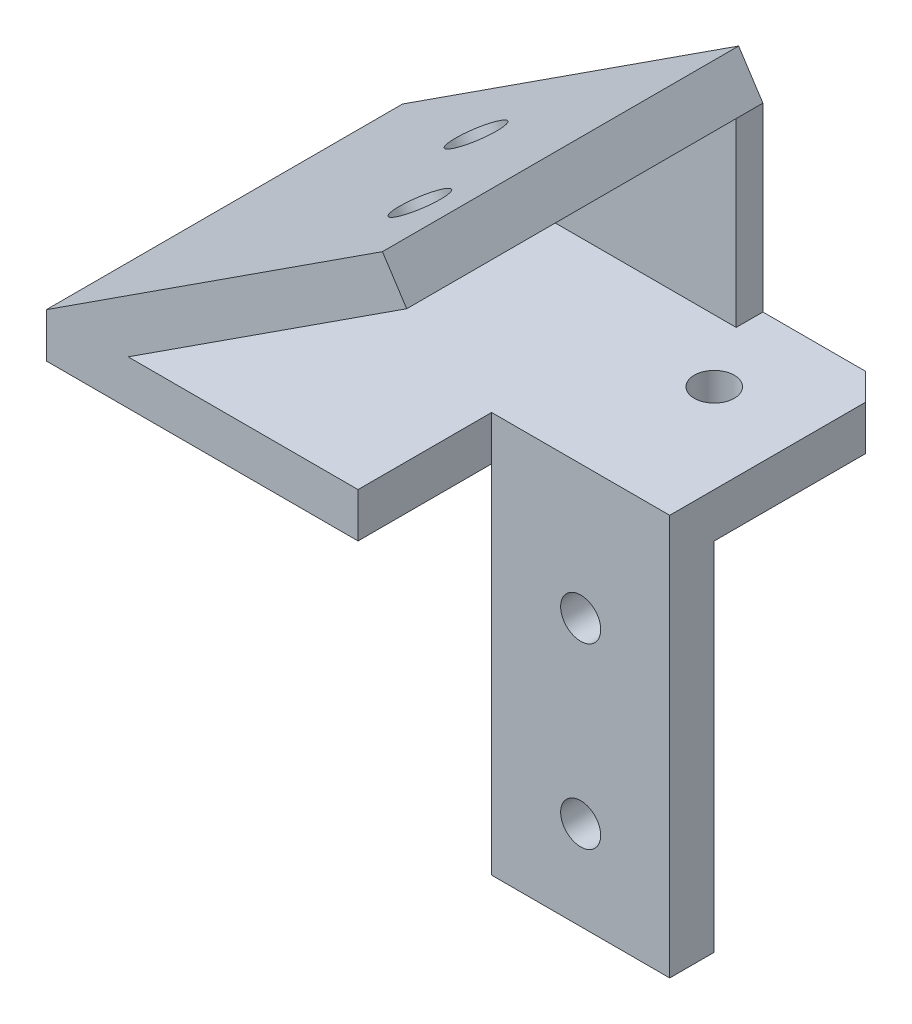
ISO-10303-21;
HEADER;
FILE_DESCRIPTION(('STEP AP214'),'2;1');
FILE_NAME('part.step','',(''),(''),'','','');
FILE_SCHEMA(('AUTOMOTIVE_DESIGN { 1 0 10303 214 1 1 1 1 }'));
ENDSEC;
DATA;
#1=APPLICATION_CONTEXT('core data for automotive mechanical design processes');
#2=APPLICATION_PROTOCOL_DEFINITION('international standard','automotive_design',2000,#1);
#3=PRODUCT_CONTEXT('',#1,'mechanical');
#4=PRODUCT('Part','Part','',(#3));
#5=PRODUCT_RELATED_PRODUCT_CATEGORY('part','',(#4));
#6=PRODUCT_DEFINITION_FORMATION('','',#4);
#7=PRODUCT_DEFINITION_CONTEXT('part definition',#1,'design');
#8=PRODUCT_DEFINITION('design','',#6,#7);
#9=PRODUCT_DEFINITION_SHAPE('','',#8);
#10=(LENGTH_UNIT() NAMED_UNIT(*) SI_UNIT(.MILLI.,.METRE.));
#11=(NAMED_UNIT(*) PLANE_ANGLE_UNIT() SI_UNIT($,.RADIAN.));
#12=(NAMED_UNIT(*) SI_UNIT($,.STERADIAN.) SOLID_ANGLE_UNIT());
#13=UNCERTAINTY_MEASURE_WITH_UNIT(LENGTH_MEASURE(1.E-05),#10,'distance_accuracy_value','');
#14=(GEOMETRIC_REPRESENTATION_CONTEXT(3) GLOBAL_UNCERTAINTY_ASSIGNED_CONTEXT((#13)) GLOBAL_UNIT_ASSIGNED_CONTEXT((#10,
#11,#12)) REPRESENTATION_CONTEXT('',''));
#15=CARTESIAN_POINT('',(0.,0.,0.));
#16=DIRECTION('',(0.,0.,1.));
#17=DIRECTION('',(1.,0.,0.));
#18=AXIS2_PLACEMENT_3D('',#15,#16,#17);
#19=CARTESIAN_POINT('',(5.46337073261944,25.3154037359487,-20.));
#20=DIRECTION('',(0.544639035015022,-0.838670567945427,0.));
#21=DIRECTION('',(0.838670567945427,0.544639035015022,0.));
#22=AXIS2_PLACEMENT_3D('',#19,#20,#21);
#23=PLANE('',#22);
#24=CARTESIAN_POINT('',(-2.08466437888939,20.4136524208135,8.25));
#25=DIRECTION('',(0.544639035015022,-0.838670567945427,0.));
#26=DIRECTION('',(0.838670567945427,0.544639035015022,0.));
#27=AXIS2_PLACEMENT_3D('',#24,#25,#26);
#28=CIRCLE('',#27,2.75);
#29=CARTESIAN_POINT('',(0.221679682960539,21.9114097671048,8.25));
#30=VERTEX_POINT('',#29);
#31=EDGE_CURVE('E162',#30,#30,#28,.F.);
#32=ORIENTED_EDGE('',*,*,#31,.T.);
#33=EDGE_LOOP('',(#32));
#34=FACE_BOUND('',#33,.T.);
#35=CARTESIAN_POINT('',(-12.0229106090427,13.9596798558855,-8.));
#36=DIRECTION('',(0.544639035015022,-0.838670567945427,0.));
#37=DIRECTION('',(0.838670567945427,0.544639035015022,0.));
#38=AXIS2_PLACEMENT_3D('',#35,#36,#37);
#39=CIRCLE('',#38,2.75);
#40=CARTESIAN_POINT('',(-9.71656654719277,15.4574372021768,-8.));
#41=VERTEX_POINT('',#40);
#42=EDGE_CURVE('E316',#41,#41,#39,.F.);
#43=ORIENTED_EDGE('',*,*,#42,.T.);
#44=EDGE_LOOP('',(#43));
#45=FACE_BOUND('',#44,.T.);
#46=DIRECTION('',(0.,0.,1.));
#47=VECTOR('',#46,1.);
#48=CARTESIAN_POINT('',(-25.8196077061162,5.,-20.));
#49=LINE('',#48,#47);
#50=CARTESIAN_POINT('',(-25.8196077061162,5.,-17.));
#51=VERTEX_POINT('',#50);
#52=CARTESIAN_POINT('',(-25.8196077061162,5.,20.));
#53=VERTEX_POINT('',#52);
#54=EDGE_CURVE('E171',#51,#53,#49,.T.);
#55=ORIENTED_EDGE('',*,*,#54,.F.);
#56=DIRECTION('',(0.838670567945427,0.544639035015022,0.));
#57=VECTOR('',#56,1.);
#58=CARTESIAN_POINT('',(-25.8196077061162,5.,-17.));
#59=LINE('',#58,#57);
#60=CARTESIAN_POINT('',(5.46337073261944,25.3154037359487,-17.));
#61=VERTEX_POINT('',#60);
#62=EDGE_CURVE('E156',#51,#61,#59,.T.);
#63=ORIENTED_EDGE('',*,*,#62,.T.);
#64=DIRECTION('',(0.,0.,1.));
#65=VECTOR('',#64,1.);
#66=CARTESIAN_POINT('',(5.46337073261944,25.3154037359487,-20.));
#67=LINE('',#66,#65);
#68=CARTESIAN_POINT('',(5.46337073261944,25.3154037359487,20.));
#69=VERTEX_POINT('',#68);
#70=EDGE_CURVE('E150',#61,#69,#67,.T.);
#71=ORIENTED_EDGE('',*,*,#70,.T.);
#72=DIRECTION('',(0.838670567945427,0.544639035015022,0.));
#73=VECTOR('',#72,1.);
#74=CARTESIAN_POINT('',(5.46337073261944,25.3154037359487,20.));
#75=LINE('',#74,#73);
#76=EDGE_CURVE('E168',#53,#69,#75,.T.);
#77=ORIENTED_EDGE('',*,*,#76,.F.);
#78=EDGE_LOOP('',(#55,#63,#71,#77));
#79=FACE_BOUND('',#78,.T.);
#80=ADVANCED_FACE('F33',(#34,#45,#79),#23,.T.);
#81=CARTESIAN_POINT('',(0.,5.,0.));
#82=DIRECTION('',(1.,0.,0.));
#83=DIRECTION('',(0.,0.,-1.));
#84=AXIS2_PLACEMENT_3D('',#81,#82,#83);
#85=PLANE('',#84);
#86=DIRECTION('',(0.,0.,1.));
#87=VECTOR('',#86,1.);
#88=CARTESIAN_POINT('',(0.,0.,-20.));
#89=LINE('',#88,#87);
#90=CARTESIAN_POINT('',(0.,0.,0.));
#91=VERTEX_POINT('',#90);
#92=CARTESIAN_POINT('',(0.,0.,5.));
#93=VERTEX_POINT('',#92);
#94=EDGE_CURVE('E11',#91,#93,#89,.T.);
#95=ORIENTED_EDGE('',*,*,#94,.F.);
#96=DIRECTION('',(0.,-1.,0.));
#97=VECTOR('',#96,1.);
#98=CARTESIAN_POINT('',(0.,5.,0.));
#99=LINE('',#98,#97);
#100=CARTESIAN_POINT('',(0.,-40.,0.));
#101=VERTEX_POINT('',#100);
#102=EDGE_CURVE('E213',#91,#101,#99,.T.);
#103=ORIENTED_EDGE('',*,*,#102,.T.);
#104=DIRECTION('',(0.,0.,-1.));
#105=VECTOR('',#104,1.);
#106=CARTESIAN_POINT('',(0.,-40.,5.));
#107=LINE('',#106,#105);
#108=CARTESIAN_POINT('',(0.,-40.,5.));
#109=VERTEX_POINT('',#108);
#110=EDGE_CURVE('E235',#109,#101,#107,.T.);
#111=ORIENTED_EDGE('',*,*,#110,.F.);
#112=DIRECTION('',(0.,-1.,0.));
#113=VECTOR('',#112,1.);
#114=CARTESIAN_POINT('',(0.,5.,5.));
#115=LINE('',#114,#113);
#116=EDGE_CURVE('E219',#93,#109,#115,.T.);
#117=ORIENTED_EDGE('',*,*,#116,.F.);
#118=EDGE_LOOP('',(#95,#103,#111,#117));
#119=FACE_BOUND('',#118,.T.);
#120=ADVANCED_FACE('F287',(#119),#85,.F.);
#121=CARTESIAN_POINT('',(0.,5.,0.));
#122=DIRECTION('',(0.,-1.,0.));
#123=DIRECTION('',(0.,0.,-1.));
#124=AXIS2_PLACEMENT_3D('',#121,#122,#123);
#125=PLANE('',#124);
#126=DIRECTION('',(-1.,0.,0.));
#127=VECTOR('',#126,1.);
#128=CARTESIAN_POINT('',(0.,5.,-20.));
#129=LINE('',#128,#127);
#130=CARTESIAN_POINT('',(17.,5.,-20.));
#131=VERTEX_POINT('',#130);
#132=CARTESIAN_POINT('',(5.46337073261944,5.,-20.));
#133=VERTEX_POINT('',#132);
#134=EDGE_CURVE('E55',#131,#133,#129,.T.);
#135=ORIENTED_EDGE('',*,*,#134,.T.);
#136=DIRECTION('',(0.,0.,-1.));
#137=VECTOR('',#136,1.);
#138=CARTESIAN_POINT('',(5.46337073261944,5.,-17.));
#139=LINE('',#138,#137);
#140=CARTESIAN_POINT('',(5.46337073261944,5.,-17.));
#141=VERTEX_POINT('',#140);
#142=EDGE_CURVE('E50',#141,#133,#139,.T.);
#143=ORIENTED_EDGE('',*,*,#142,.F.);
#144=DIRECTION('',(-1.,0.,0.));
#145=VECTOR('',#144,1.);
#146=CARTESIAN_POINT('',(5.46337073261944,5.,-17.));
#147=LINE('',#146,#145);
#148=EDGE_CURVE('E166',#141,#51,#147,.T.);
#149=ORIENTED_EDGE('',*,*,#148,.T.);
#150=ORIENTED_EDGE('',*,*,#54,.T.);
#151=DIRECTION('',(1.,0.,0.));
#152=VECTOR('',#151,1.);
#153=CARTESIAN_POINT('',(-35.,5.,20.));
#154=LINE('',#153,#152);
#155=CARTESIAN_POINT('',(0.,5.,20.));
#156=VERTEX_POINT('',#155);
#157=EDGE_CURVE('E192',#53,#156,#154,.T.);
#158=ORIENTED_EDGE('',*,*,#157,.T.);
#159=DIRECTION('',(0.,0.,-1.));
#160=VECTOR('',#159,1.);
#161=CARTESIAN_POINT('',(0.,5.,-20.));
#162=LINE('',#161,#160);
#163=CARTESIAN_POINT('',(0.,5.,5.));
#164=VERTEX_POINT('',#163);
#165=EDGE_CURVE('E185',#156,#164,#162,.T.);
#166=ORIENTED_EDGE('',*,*,#165,.T.);
#167=DIRECTION('',(-1.,0.,0.));
#168=VECTOR('',#167,1.);
#169=CARTESIAN_POINT('',(0.,5.,5.));
#170=LINE('',#169,#168);
#171=CARTESIAN_POINT('',(20.,5.,5.));
#172=VERTEX_POINT('',#171);
#173=EDGE_CURVE('E224',#172,#164,#170,.T.);
#174=ORIENTED_EDGE('',*,*,#173,.F.);
#175=DIRECTION('',(0.,0.,-1.));
#176=VECTOR('',#175,1.);
#177=CARTESIAN_POINT('',(20.,5.,0.));
#178=LINE('',#177,#176);
#179=CARTESIAN_POINT('',(20.,5.,-17.));
#180=VERTEX_POINT('',#179);
#181=EDGE_CURVE('E245',#172,#180,#178,.T.);
#182=ORIENTED_EDGE('',*,*,#181,.T.);
#183=DIRECTION('',(0.707106781186546,0.,0.707106781186549));
#184=VECTOR('',#183,1.);
#185=CARTESIAN_POINT('',(17.,5.,-20.));
#186=LINE('',#185,#184);
#187=EDGE_CURVE('E37',#180,#131,#186,.F.);
#188=ORIENTED_EDGE('',*,*,#187,.T.);
#189=EDGE_LOOP('',(#135,#143,#149,#150,#158,#166,#174,#182,#188));
#190=FACE_BOUND('',#189,.T.);
#191=CARTESIAN_POINT('',(10.,5.,-10.));
#192=DIRECTION('',(0.,1.,0.));
#193=DIRECTION('',(0.,0.,1.));
#194=AXIS2_PLACEMENT_3D('',#191,#192,#193);
#195=CIRCLE('',#194,2.25);
#196=CARTESIAN_POINT('',(10.,5.,-7.75));
#197=VERTEX_POINT('',#196);
#198=EDGE_CURVE('E239',#197,#197,#195,.T.);
#199=ORIENTED_EDGE('',*,*,#198,.F.);
#200=EDGE_LOOP('',(#199));
#201=FACE_BOUND('',#200,.T.);
#202=ADVANCED_FACE('F264',(#190,#201),#125,.F.);
#203=CARTESIAN_POINT('',(0.,0.,0.));
#204=DIRECTION('',(0.,-1.,0.));
#205=DIRECTION('',(0.,0.,-1.));
#206=AXIS2_PLACEMENT_3D('',#203,#204,#205);
#207=PLANE('',#206);
#208=DIRECTION('',(-1.,0.,0.));
#209=VECTOR('',#208,1.);
#210=CARTESIAN_POINT('',(0.,0.,-20.));
#211=LINE('',#210,#209);
#212=CARTESIAN_POINT('',(17.,0.,-20.));
#213=VERTEX_POINT('',#212);
#214=CARTESIAN_POINT('',(-35.,0.,-20.));
#215=VERTEX_POINT('',#214);
#216=EDGE_CURVE('E248',#213,#215,#211,.T.);
#217=ORIENTED_EDGE('',*,*,#216,.F.);
#218=DIRECTION('',(-0.707106781186546,0.,-0.707106781186549));
#219=VECTOR('',#218,1.);
#220=CARTESIAN_POINT('',(18.5,0.,-18.5));
#221=LINE('',#220,#219);
#222=CARTESIAN_POINT('',(20.,0.,-17.));
#223=VERTEX_POINT('',#222);
#224=EDGE_CURVE('E259',#213,#223,#221,.F.);
#225=ORIENTED_EDGE('',*,*,#224,.T.);
#226=DIRECTION('',(0.,0.,-1.));
#227=VECTOR('',#226,1.);
#228=CARTESIAN_POINT('',(20.,0.,0.));
#229=LINE('',#228,#227);
#230=CARTESIAN_POINT('',(20.,0.,0.));
#231=VERTEX_POINT('',#230);
#232=EDGE_CURVE('E253',#231,#223,#229,.T.);
#233=ORIENTED_EDGE('',*,*,#232,.F.);
#234=DIRECTION('',(1.,0.,0.));
#235=VECTOR('',#234,1.);
#236=CARTESIAN_POINT('',(0.,0.,0.));
#237=LINE('',#236,#235);
#238=EDGE_CURVE('E242',#91,#231,#237,.T.);
#239=ORIENTED_EDGE('',*,*,#238,.F.);
#240=ORIENTED_EDGE('',*,*,#94,.T.);
#241=CARTESIAN_POINT('',(0.,0.,20.));
#242=VERTEX_POINT('',#241);
#243=EDGE_CURVE('E43',#93,#242,#89,.T.);
#244=ORIENTED_EDGE('',*,*,#243,.T.);
#245=DIRECTION('',(1.,0.,0.));
#246=VECTOR('',#245,1.);
#247=CARTESIAN_POINT('',(-35.,0.,20.));
#248=LINE('',#247,#246);
#249=CARTESIAN_POINT('',(-35.,0.,20.));
#250=VERTEX_POINT('',#249);
#251=EDGE_CURVE('E200',#250,#242,#248,.T.);
#252=ORIENTED_EDGE('',*,*,#251,.F.);
#253=DIRECTION('',(0.,0.,1.));
#254=VECTOR('',#253,1.);
#255=CARTESIAN_POINT('',(-35.,0.,-20.));
#256=LINE('',#255,#254);
#257=EDGE_CURVE('E184',#215,#250,#256,.T.);
#258=ORIENTED_EDGE('',*,*,#257,.F.);
#259=EDGE_LOOP('',(#217,#225,#233,#239,#240,#244,#252,#258));
#260=FACE_BOUND('',#259,.T.);
#261=CARTESIAN_POINT('',(10.,0.,-10.));
#262=DIRECTION('',(0.,1.,0.));
#263=DIRECTION('',(0.,0.,1.));
#264=AXIS2_PLACEMENT_3D('',#261,#262,#263);
#265=CIRCLE('',#264,2.25);
#266=CARTESIAN_POINT('',(10.,0.,-7.75));
#267=VERTEX_POINT('',#266);
#268=EDGE_CURVE('E238',#267,#267,#265,.T.);
#269=ORIENTED_EDGE('',*,*,#268,.T.);
#270=EDGE_LOOP('',(#269));
#271=FACE_BOUND('',#270,.T.);
#272=ADVANCED_FACE('F271',(#260,#271),#207,.T.);
#273=CARTESIAN_POINT('',(20.,5.,0.));
#274=DIRECTION('',(-1.,0.,0.));
#275=DIRECTION('',(0.,0.,1.));
#276=AXIS2_PLACEMENT_3D('',#273,#274,#275);
#277=PLANE('',#276);
#278=ORIENTED_EDGE('',*,*,#232,.T.);
#279=DIRECTION('',(0.,1.,0.));
#280=VECTOR('',#279,1.);
#281=CARTESIAN_POINT('',(20.,5.,-17.));
#282=LINE('',#281,#280);
#283=EDGE_CURVE('E260',#223,#180,#282,.T.);
#284=ORIENTED_EDGE('',*,*,#283,.T.);
#285=ORIENTED_EDGE('',*,*,#181,.F.);
#286=DIRECTION('',(0.,1.,0.));
#287=VECTOR('',#286,1.);
#288=CARTESIAN_POINT('',(20.,5.,5.));
#289=LINE('',#288,#287);
#290=CARTESIAN_POINT('',(20.,-40.,5.));
#291=VERTEX_POINT('',#290);
#292=EDGE_CURVE('E221',#291,#172,#289,.T.);
#293=ORIENTED_EDGE('',*,*,#292,.F.);
#294=DIRECTION('',(0.,0.,-1.));
#295=VECTOR('',#294,1.);
#296=CARTESIAN_POINT('',(20.,-40.,5.));
#297=LINE('',#296,#295);
#298=CARTESIAN_POINT('',(20.,-40.,0.));
#299=VERTEX_POINT('',#298);
#300=EDGE_CURVE('E226',#291,#299,#297,.T.);
#301=ORIENTED_EDGE('',*,*,#300,.T.);
#302=DIRECTION('',(0.,1.,0.));
#303=VECTOR('',#302,1.);
#304=CARTESIAN_POINT('',(20.,5.,0.));
#305=LINE('',#304,#303);
#306=EDGE_CURVE('E230',#299,#231,#305,.T.);
#307=ORIENTED_EDGE('',*,*,#306,.T.);
#308=EDGE_LOOP('',(#278,#284,#285,#293,#301,#307));
#309=FACE_BOUND('',#308,.T.);
#310=ADVANCED_FACE('F275',(#309),#277,.F.);
#311=CARTESIAN_POINT('',(0.,5.,-20.));
#312=DIRECTION('',(0.,0.,1.));
#313=DIRECTION('',(1.,0.,0.));
#314=AXIS2_PLACEMENT_3D('',#311,#312,#313);
#315=PLANE('',#314);
#316=ORIENTED_EDGE('',*,*,#134,.F.);
#317=DIRECTION('',(0.,-1.,0.));
#318=VECTOR('',#317,1.);
#319=CARTESIAN_POINT('',(17.,5.,-20.));
#320=LINE('',#319,#318);
#321=EDGE_CURVE('E250',#131,#213,#320,.T.);
#322=ORIENTED_EDGE('',*,*,#321,.T.);
#323=ORIENTED_EDGE('',*,*,#216,.T.);
#324=DIRECTION('',(0.,-1.,0.));
#325=VECTOR('',#324,1.);
#326=CARTESIAN_POINT('',(-35.,5.,-20.));
#327=LINE('',#326,#325);
#328=CARTESIAN_POINT('',(-35.,5.,-20.));
#329=VERTEX_POINT('',#328);
#330=EDGE_CURVE('E181',#329,#215,#327,.T.);
#331=ORIENTED_EDGE('',*,*,#330,.F.);
#332=DIRECTION('',(-0.838670567945427,-0.544639035015022,0.));
#333=VECTOR('',#332,1.);
#334=CARTESIAN_POINT('',(-35.,5.,-20.));
#335=LINE('',#334,#333);
#336=CARTESIAN_POINT('',(2.74017555754422,29.508756575676,-20.));
#337=VERTEX_POINT('',#336);
#338=EDGE_CURVE('E141',#337,#329,#335,.T.);
#339=ORIENTED_EDGE('',*,*,#338,.F.);
#340=DIRECTION('',(-0.54463903501502,0.838670567945429,0.));
#341=VECTOR('',#340,1.);
#342=CARTESIAN_POINT('',(2.74017555754422,29.508756575676,-20.));
#343=LINE('',#342,#341);
#344=CARTESIAN_POINT('',(5.46337073261944,25.3154037359487,-20.));
#345=VERTEX_POINT('',#344);
#346=EDGE_CURVE('E135',#345,#337,#343,.T.);
#347=ORIENTED_EDGE('',*,*,#346,.F.);
#348=DIRECTION('',(0.,-1.,0.));
#349=VECTOR('',#348,1.);
#350=CARTESIAN_POINT('',(5.46337073261944,25.3154037359487,-20.));
#351=LINE('',#350,#349);
#352=EDGE_CURVE('E139',#345,#133,#351,.T.);
#353=ORIENTED_EDGE('',*,*,#352,.T.);
#354=EDGE_LOOP('',(#316,#322,#323,#331,#339,#347,#353));
#355=FACE_BOUND('',#354,.T.);
#356=ADVANCED_FACE('F137',(#355),#315,.F.);
#357=CARTESIAN_POINT('',(10.,5.,-10.));
#358=DIRECTION('',(0.,-1.,0.));
#359=DIRECTION('',(0.,0.,-1.));
#360=AXIS2_PLACEMENT_3D('',#357,#358,#359);
#361=CYLINDRICAL_SURFACE('',#360,2.25);
#362=ORIENTED_EDGE('',*,*,#198,.T.);
#363=EDGE_LOOP('',(#362));
#364=FACE_BOUND('',#363,.T.);
#365=ORIENTED_EDGE('',*,*,#268,.F.);
#366=EDGE_LOOP('',(#365));
#367=FACE_BOUND('',#366,.T.);
#368=ADVANCED_FACE('F372',(#364,#367),#361,.F.);
#369=CARTESIAN_POINT('',(0.,0.,0.));
#370=DIRECTION('',(0.,0.,1.));
#371=DIRECTION('',(1.,0.,0.));
#372=AXIS2_PLACEMENT_3D('',#369,#370,#371);
#373=PLANE('',#372);
#374=CARTESIAN_POINT('',(10.,-30.,0.));
#375=DIRECTION('',(0.,0.,1.));
#376=DIRECTION('',(1.,0.,0.));
#377=AXIS2_PLACEMENT_3D('',#374,#375,#376);
#378=CIRCLE('',#377,2.25);
#379=CARTESIAN_POINT('',(12.25,-30.,0.));
#380=VERTEX_POINT('',#379);
#381=EDGE_CURVE('E207',#380,#380,#378,.T.);
#382=ORIENTED_EDGE('',*,*,#381,.T.);
#383=EDGE_LOOP('',(#382));
#384=FACE_BOUND('',#383,.T.);
#385=CARTESIAN_POINT('',(10.,-10.,0.));
#386=DIRECTION('',(0.,0.,1.));
#387=DIRECTION('',(1.,0.,0.));
#388=AXIS2_PLACEMENT_3D('',#385,#386,#387);
#389=CIRCLE('',#388,2.25);
#390=CARTESIAN_POINT('',(12.25,-10.,0.));
#391=VERTEX_POINT('',#390);
#392=EDGE_CURVE('E203',#391,#391,#389,.T.);
#393=ORIENTED_EDGE('',*,*,#392,.T.);
#394=EDGE_LOOP('',(#393));
#395=FACE_BOUND('',#394,.T.);
#396=ORIENTED_EDGE('',*,*,#102,.F.);
#397=ORIENTED_EDGE('',*,*,#238,.T.);
#398=ORIENTED_EDGE('',*,*,#306,.F.);
#399=DIRECTION('',(1.,0.,0.));
#400=VECTOR('',#399,1.);
#401=CARTESIAN_POINT('',(0.,-40.,0.));
#402=LINE('',#401,#400);
#403=EDGE_CURVE('E228',#101,#299,#402,.T.);
#404=ORIENTED_EDGE('',*,*,#403,.F.);
#405=EDGE_LOOP('',(#396,#397,#398,#404));
#406=FACE_BOUND('',#405,.T.);
#407=ADVANCED_FACE('F282',(#384,#395,#406),#373,.F.);
#408=CARTESIAN_POINT('',(0.,0.,5.));
#409=DIRECTION('',(0.,0.,1.));
#410=DIRECTION('',(1.,0.,0.));
#411=AXIS2_PLACEMENT_3D('',#408,#409,#410);
#412=PLANE('',#411);
#413=CARTESIAN_POINT('',(10.,-30.,5.));
#414=DIRECTION('',(0.,0.,1.));
#415=DIRECTION('',(1.,0.,0.));
#416=AXIS2_PLACEMENT_3D('',#413,#414,#415);
#417=CIRCLE('',#416,2.25);
#418=CARTESIAN_POINT('',(12.25,-30.,5.));
#419=VERTEX_POINT('',#418);
#420=EDGE_CURVE('E210',#419,#419,#417,.T.);
#421=ORIENTED_EDGE('',*,*,#420,.F.);
#422=EDGE_LOOP('',(#421));
#423=FACE_BOUND('',#422,.T.);
#424=EDGE_CURVE('E216',#164,#93,#115,.T.);
#425=ORIENTED_EDGE('',*,*,#424,.T.);
#426=ORIENTED_EDGE('',*,*,#116,.T.);
#427=DIRECTION('',(1.,0.,0.));
#428=VECTOR('',#427,1.);
#429=CARTESIAN_POINT('',(0.,-40.,5.));
#430=LINE('',#429,#428);
#431=EDGE_CURVE('E218',#109,#291,#430,.T.);
#432=ORIENTED_EDGE('',*,*,#431,.T.);
#433=ORIENTED_EDGE('',*,*,#292,.T.);
#434=ORIENTED_EDGE('',*,*,#173,.T.);
#435=EDGE_LOOP('',(#425,#426,#432,#433,#434));
#436=FACE_BOUND('',#435,.T.);
#437=CARTESIAN_POINT('',(10.,-10.,5.));
#438=DIRECTION('',(0.,0.,1.));
#439=DIRECTION('',(1.,0.,0.));
#440=AXIS2_PLACEMENT_3D('',#437,#438,#439);
#441=CIRCLE('',#440,2.25);
#442=CARTESIAN_POINT('',(12.25,-10.,5.));
#443=VERTEX_POINT('',#442);
#444=EDGE_CURVE('E204',#443,#443,#441,.T.);
#445=ORIENTED_EDGE('',*,*,#444,.F.);
#446=EDGE_LOOP('',(#445));
#447=FACE_BOUND('',#446,.T.);
#448=ADVANCED_FACE('F366',(#423,#436,#447),#412,.T.);
#449=CARTESIAN_POINT('',(0.,-40.,5.));
#450=DIRECTION('',(0.,1.,0.));
#451=DIRECTION('',(0.,0.,1.));
#452=AXIS2_PLACEMENT_3D('',#449,#450,#451);
#453=PLANE('',#452);
#454=ORIENTED_EDGE('',*,*,#403,.T.);
#455=ORIENTED_EDGE('',*,*,#300,.F.);
#456=ORIENTED_EDGE('',*,*,#431,.F.);
#457=ORIENTED_EDGE('',*,*,#110,.T.);
#458=EDGE_LOOP('',(#454,#455,#456,#457));
#459=FACE_BOUND('',#458,.T.);
#460=ADVANCED_FACE('F364',(#459),#453,.F.);
#461=CARTESIAN_POINT('',(10.,-30.,5.));
#462=DIRECTION('',(0.,0.,-1.));
#463=DIRECTION('',(-1.,0.,0.));
#464=AXIS2_PLACEMENT_3D('',#461,#462,#463);
#465=CYLINDRICAL_SURFACE('',#464,2.25);
#466=ORIENTED_EDGE('',*,*,#420,.T.);
#467=EDGE_LOOP('',(#466));
#468=FACE_BOUND('',#467,.T.);
#469=ORIENTED_EDGE('',*,*,#381,.F.);
#470=EDGE_LOOP('',(#469));
#471=FACE_BOUND('',#470,.T.);
#472=ADVANCED_FACE('F360',(#468,#471),#465,.F.);
#473=CARTESIAN_POINT('',(10.,-10.,5.));
#474=DIRECTION('',(0.,0.,-1.));
#475=DIRECTION('',(-1.,0.,0.));
#476=AXIS2_PLACEMENT_3D('',#473,#474,#475);
#477=CYLINDRICAL_SURFACE('',#476,2.25);
#478=ORIENTED_EDGE('',*,*,#444,.T.);
#479=EDGE_LOOP('',(#478));
#480=FACE_BOUND('',#479,.T.);
#481=ORIENTED_EDGE('',*,*,#392,.F.);
#482=EDGE_LOOP('',(#481));
#483=FACE_BOUND('',#482,.T.);
#484=ADVANCED_FACE('F357',(#480,#483),#477,.F.);
#485=CARTESIAN_POINT('',(17.,5.,-20.));
#486=DIRECTION('',(-0.707106781186549,0.,0.707106781186546));
#487=DIRECTION('',(0.,-1.,0.));
#488=AXIS2_PLACEMENT_3D('',#485,#486,#487);
#489=PLANE('',#488);
#490=ORIENTED_EDGE('',*,*,#187,.F.);
#491=ORIENTED_EDGE('',*,*,#283,.F.);
#492=ORIENTED_EDGE('',*,*,#224,.F.);
#493=ORIENTED_EDGE('',*,*,#321,.F.);
#494=EDGE_LOOP('',(#490,#491,#492,#493));
#495=FACE_BOUND('',#494,.T.);
#496=ADVANCED_FACE('F35',(#495),#489,.F.);
#497=CARTESIAN_POINT('',(-35.,5.,20.));
#498=DIRECTION('',(0.,0.,-1.));
#499=DIRECTION('',(-1.,0.,0.));
#500=AXIS2_PLACEMENT_3D('',#497,#498,#499);
#501=PLANE('',#500);
#502=DIRECTION('',(0.,1.,0.));
#503=VECTOR('',#502,1.);
#504=CARTESIAN_POINT('',(0.,5.,20.));
#505=LINE('',#504,#503);
#506=EDGE_CURVE('E194',#242,#156,#505,.T.);
#507=ORIENTED_EDGE('',*,*,#506,.T.);
#508=ORIENTED_EDGE('',*,*,#157,.F.);
#509=ORIENTED_EDGE('',*,*,#76,.T.);
#510=DIRECTION('',(-0.54463903501502,0.838670567945429,0.));
#511=VECTOR('',#510,1.);
#512=CARTESIAN_POINT('',(2.74017555754422,29.508756575676,20.));
#513=LINE('',#512,#511);
#514=CARTESIAN_POINT('',(2.74017555754422,29.508756575676,20.));
#515=VERTEX_POINT('',#514);
#516=EDGE_CURVE('E174',#69,#515,#513,.T.);
#517=ORIENTED_EDGE('',*,*,#516,.T.);
#518=DIRECTION('',(-0.838670567945427,-0.544639035015022,0.));
#519=VECTOR('',#518,1.);
#520=CARTESIAN_POINT('',(-35.,5.,20.));
#521=LINE('',#520,#519);
#522=CARTESIAN_POINT('',(-35.,5.,20.));
#523=VERTEX_POINT('',#522);
#524=EDGE_CURVE('E143',#515,#523,#521,.T.);
#525=ORIENTED_EDGE('',*,*,#524,.T.);
#526=DIRECTION('',(0.,1.,0.));
#527=VECTOR('',#526,1.);
#528=CARTESIAN_POINT('',(-35.,5.,20.));
#529=LINE('',#528,#527);
#530=EDGE_CURVE('E187',#250,#523,#529,.T.);
#531=ORIENTED_EDGE('',*,*,#530,.F.);
#532=ORIENTED_EDGE('',*,*,#251,.T.);
#533=EDGE_LOOP('',(#507,#508,#509,#517,#525,#531,#532));
#534=FACE_BOUND('',#533,.T.);
#535=ADVANCED_FACE('F298',(#534),#501,.F.);
#536=CARTESIAN_POINT('',(-35.,0.,0.));
#537=DIRECTION('',(-1.,0.,0.));
#538=DIRECTION('',(0.,0.,1.));
#539=AXIS2_PLACEMENT_3D('',#536,#537,#538);
#540=PLANE('',#539);
#541=ORIENTED_EDGE('',*,*,#330,.T.);
#542=ORIENTED_EDGE('',*,*,#257,.T.);
#543=ORIENTED_EDGE('',*,*,#530,.T.);
#544=DIRECTION('',(0.,0.,-1.));
#545=VECTOR('',#544,1.);
#546=CARTESIAN_POINT('',(-35.,5.,-20.));
#547=LINE('',#546,#545);
#548=EDGE_CURVE('E190',#523,#329,#547,.T.);
#549=ORIENTED_EDGE('',*,*,#548,.T.);
#550=EDGE_LOOP('',(#541,#542,#543,#549));
#551=FACE_BOUND('',#550,.T.);
#552=ADVANCED_FACE('F301',(#551),#540,.T.);
#553=CARTESIAN_POINT('',(0.,0.,0.));
#554=DIRECTION('',(-1.,0.,0.));
#555=DIRECTION('',(0.,0.,1.));
#556=AXIS2_PLACEMENT_3D('',#553,#554,#555);
#557=PLANE('',#556);
#558=ORIENTED_EDGE('',*,*,#424,.F.);
#559=ORIENTED_EDGE('',*,*,#165,.F.);
#560=ORIENTED_EDGE('',*,*,#506,.F.);
#561=ORIENTED_EDGE('',*,*,#243,.F.);
#562=EDGE_LOOP('',(#558,#559,#560,#561));
#563=FACE_BOUND('',#562,.T.);
#564=ADVANCED_FACE('F294',(#563),#557,.F.);
#565=CARTESIAN_POINT('',(-35.,5.,-20.));
#566=DIRECTION('',(-0.544639035015022,0.838670567945427,0.));
#567=DIRECTION('',(-0.838670567945427,-0.544639035015022,0.));
#568=AXIS2_PLACEMENT_3D('',#565,#566,#567);
#569=PLANE('',#568);
#570=CARTESIAN_POINT('',(-4.80785955396462,24.6070052605408,8.25));
#571=DIRECTION('',(-0.544639035015022,0.838670567945427,0.));
#572=DIRECTION('',(-0.838670567945427,-0.544639035015022,0.));
#573=AXIS2_PLACEMENT_3D('',#570,#571,#572);
#574=CIRCLE('',#573,2.75);
#575=CARTESIAN_POINT('',(-7.11420361581455,23.1092479142495,8.25));
#576=VERTEX_POINT('',#575);
#577=EDGE_CURVE('E157',#576,#576,#574,.T.);
#578=ORIENTED_EDGE('',*,*,#577,.F.);
#579=EDGE_LOOP('',(#578));
#580=FACE_BOUND('',#579,.T.);
#581=CARTESIAN_POINT('',(-14.7461057841179,18.1530326956128,-8.));
#582=DIRECTION('',(-0.544639035015022,0.838670567945427,0.));
#583=DIRECTION('',(-0.838670567945427,-0.544639035015022,0.));
#584=AXIS2_PLACEMENT_3D('',#581,#582,#583);
#585=CIRCLE('',#584,2.75);
#586=CARTESIAN_POINT('',(-17.0524498459679,16.6552753493215,-8.));
#587=VERTEX_POINT('',#586);
#588=EDGE_CURVE('E313',#587,#587,#585,.T.);
#589=ORIENTED_EDGE('',*,*,#588,.F.);
#590=EDGE_LOOP('',(#589));
#591=FACE_BOUND('',#590,.T.);
#592=ORIENTED_EDGE('',*,*,#524,.F.);
#593=DIRECTION('',(0.,0.,1.));
#594=VECTOR('',#593,1.);
#595=CARTESIAN_POINT('',(2.74017555754422,29.508756575676,-20.));
#596=LINE('',#595,#594);
#597=EDGE_CURVE('E153',#337,#515,#596,.T.);
#598=ORIENTED_EDGE('',*,*,#597,.F.);
#599=ORIENTED_EDGE('',*,*,#338,.T.);
#600=ORIENTED_EDGE('',*,*,#548,.F.);
#601=EDGE_LOOP('',(#592,#598,#599,#600));
#602=FACE_BOUND('',#601,.T.);
#603=ADVANCED_FACE('F304',(#580,#591,#602),#569,.T.);
#604=CARTESIAN_POINT('',(2.74017555754422,29.508756575676,-20.));
#605=DIRECTION('',(0.838670567945429,0.54463903501502,0.));
#606=DIRECTION('',(-0.54463903501502,0.838670567945429,0.));
#607=AXIS2_PLACEMENT_3D('',#604,#605,#606);
#608=PLANE('',#607);
#609=ORIENTED_EDGE('',*,*,#516,.F.);
#610=ORIENTED_EDGE('',*,*,#70,.F.);
#611=EDGE_CURVE('E147',#345,#61,#67,.T.);
#612=ORIENTED_EDGE('',*,*,#611,.F.);
#613=ORIENTED_EDGE('',*,*,#346,.T.);
#614=ORIENTED_EDGE('',*,*,#597,.T.);
#615=EDGE_LOOP('',(#609,#610,#612,#613,#614));
#616=FACE_BOUND('',#615,.T.);
#617=ADVANCED_FACE('F149',(#616),#608,.T.);
#618=CARTESIAN_POINT('',(5.46337073261944,25.3154037359487,-17.));
#619=DIRECTION('',(1.,0.,0.));
#620=DIRECTION('',(0.,1.,0.));
#621=AXIS2_PLACEMENT_3D('',#618,#619,#620);
#622=PLANE('',#621);
#623=ORIENTED_EDGE('',*,*,#352,.F.);
#624=ORIENTED_EDGE('',*,*,#611,.T.);
#625=DIRECTION('',(0.,-1.,0.));
#626=VECTOR('',#625,1.);
#627=CARTESIAN_POINT('',(5.46337073261944,25.3154037359487,-17.));
#628=LINE('',#627,#626);
#629=EDGE_CURVE('E159',#61,#141,#628,.T.);
#630=ORIENTED_EDGE('',*,*,#629,.T.);
#631=ORIENTED_EDGE('',*,*,#142,.T.);
#632=EDGE_LOOP('',(#623,#624,#630,#631));
#633=FACE_BOUND('',#632,.T.);
#634=ADVANCED_FACE('F155',(#633),#622,.T.);
#635=CARTESIAN_POINT('',(0.,0.,-17.));
#636=DIRECTION('',(0.,0.,-1.));
#637=DIRECTION('',(-1.,0.,0.));
#638=AXIS2_PLACEMENT_3D('',#635,#636,#637);
#639=PLANE('',#638);
#640=ORIENTED_EDGE('',*,*,#62,.F.);
#641=ORIENTED_EDGE('',*,*,#148,.F.);
#642=ORIENTED_EDGE('',*,*,#629,.F.);
#643=EDGE_LOOP('',(#640,#641,#642));
#644=FACE_BOUND('',#643,.T.);
#645=ADVANCED_FACE('F311',(#644),#639,.F.);
#646=CARTESIAN_POINT('',(22.124162732663,-38.6222019998147,-8.));
#647=DIRECTION('',(-0.544639035015022,0.838670567945427,0.));
#648=DIRECTION('',(-0.838670567945427,-0.544639035015022,0.));
#649=AXIS2_PLACEMENT_3D('',#646,#647,#648);
#650=CYLINDRICAL_SURFACE('',#649,2.75);
#651=ORIENTED_EDGE('',*,*,#42,.F.);
#652=EDGE_LOOP('',(#651));
#653=FACE_BOUND('',#652,.T.);
#654=ORIENTED_EDGE('',*,*,#588,.T.);
#655=EDGE_LOOP('',(#654));
#656=FACE_BOUND('',#655,.T.);
#657=ADVANCED_FACE('F327',(#653,#656),#650,.F.);
#658=CARTESIAN_POINT('',(32.0624089628163,-32.1682294348867,8.25));
#659=DIRECTION('',(-0.544639035015022,0.838670567945427,0.));
#660=DIRECTION('',(-0.838670567945427,-0.544639035015022,0.));
#661=AXIS2_PLACEMENT_3D('',#658,#659,#660);
#662=CYLINDRICAL_SURFACE('',#661,2.75);
#663=ORIENTED_EDGE('',*,*,#31,.F.);
#664=EDGE_LOOP('',(#663));
#665=FACE_BOUND('',#664,.T.);
#666=ORIENTED_EDGE('',*,*,#577,.T.);
#667=EDGE_LOOP('',(#666));
#668=FACE_BOUND('',#667,.T.);
#669=ADVANCED_FACE('F324',(#665,#668),#662,.F.);
#670=CLOSED_SHELL('',(#80,#120,#202,#272,#310,#356,#368,#407,#448,#460,#472,#484,#496,#535,#552,
#564,#603,#617,#634,#645,#657,#669));
#671=MANIFOLD_SOLID_BREP('B2',#670);
#672=ADVANCED_BREP_SHAPE_REPRESENTATION('',(#18,#671),#14);
#673=SHAPE_DEFINITION_REPRESENTATION(#9,#672);
ENDSEC;
END-ISO-10303-21;
